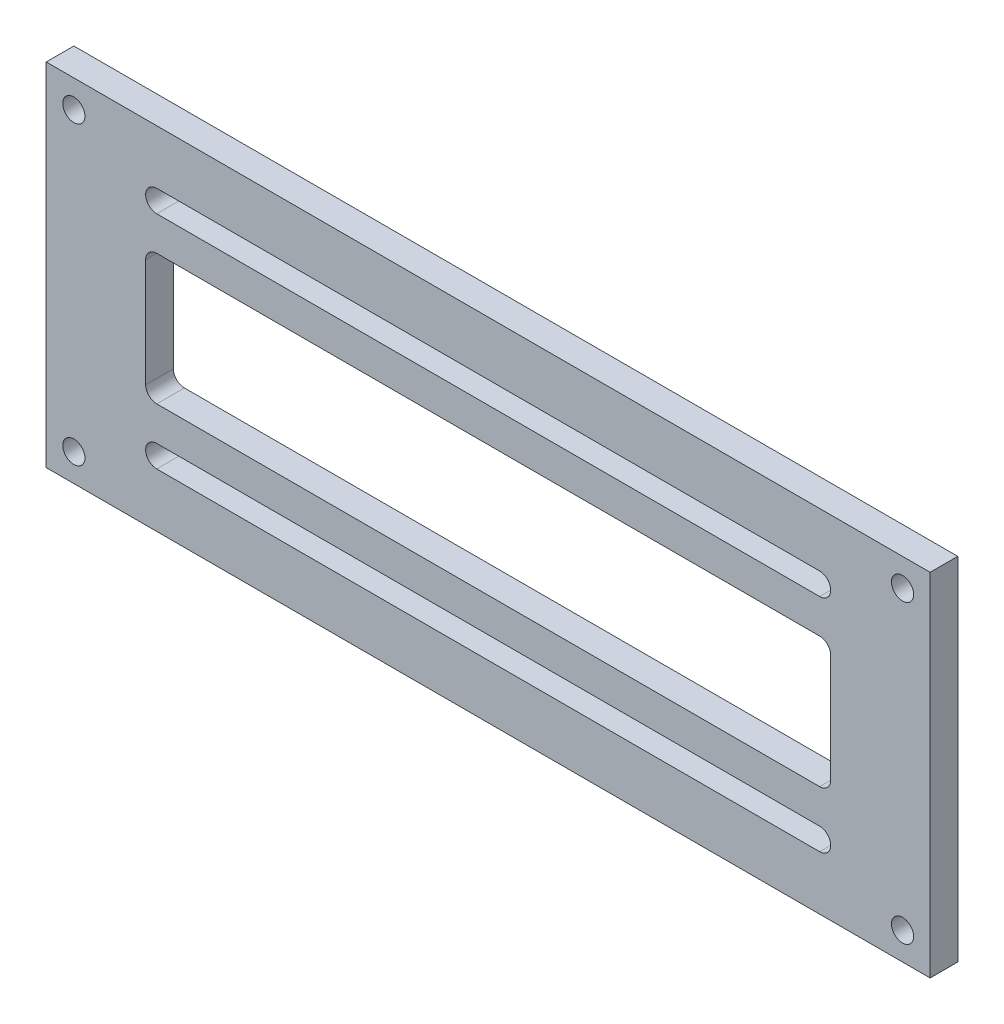
ISO-10303-21;
HEADER;
FILE_DESCRIPTION(('STEP AP214'),'2;1');
FILE_NAME('part.step','',(''),(''),'','','');
FILE_SCHEMA(('AUTOMOTIVE_DESIGN { 1 0 10303 214 1 1 1 1 }'));
ENDSEC;
DATA;
#1=APPLICATION_CONTEXT('core data for automotive mechanical design processes');
#2=APPLICATION_PROTOCOL_DEFINITION('international standard','automotive_design',2000,#1);
#3=PRODUCT_CONTEXT('',#1,'mechanical');
#4=PRODUCT('Part','Part','',(#3));
#5=PRODUCT_RELATED_PRODUCT_CATEGORY('part','',(#4));
#6=PRODUCT_DEFINITION_FORMATION('','',#4);
#7=PRODUCT_DEFINITION_CONTEXT('part definition',#1,'design');
#8=PRODUCT_DEFINITION('design','',#6,#7);
#9=PRODUCT_DEFINITION_SHAPE('','',#8);
#10=(LENGTH_UNIT() NAMED_UNIT(*) SI_UNIT(.MILLI.,.METRE.));
#11=(NAMED_UNIT(*) PLANE_ANGLE_UNIT() SI_UNIT($,.RADIAN.));
#12=(NAMED_UNIT(*) SI_UNIT($,.STERADIAN.) SOLID_ANGLE_UNIT());
#13=UNCERTAINTY_MEASURE_WITH_UNIT(LENGTH_MEASURE(1.E-05),#10,'distance_accuracy_value','');
#14=(GEOMETRIC_REPRESENTATION_CONTEXT(3) GLOBAL_UNCERTAINTY_ASSIGNED_CONTEXT((#13)) GLOBAL_UNIT_ASSIGNED_CONTEXT((#10,
#11,#12)) REPRESENTATION_CONTEXT('',''));
#15=CARTESIAN_POINT('',(0.,0.,0.));
#16=DIRECTION('',(0.,0.,1.));
#17=DIRECTION('',(1.,0.,0.));
#18=AXIS2_PLACEMENT_3D('',#15,#16,#17);
#19=CARTESIAN_POINT('',(101.6,40.386,0.));
#20=DIRECTION('',(0.,0.,1.));
#21=DIRECTION('',(1.,0.,0.));
#22=AXIS2_PLACEMENT_3D('',#19,#20,#21);
#23=PLANE('',#22);
#24=CARTESIAN_POINT('',(6.35,6.35,0.));
#25=DIRECTION('',(0.,0.,1.));
#26=DIRECTION('',(1.,0.,0.));
#27=AXIS2_PLACEMENT_3D('',#24,#25,#26);
#28=CIRCLE('',#27,2.5527);
#29=CARTESIAN_POINT('',(8.9027,6.35,0.));
#30=VERTEX_POINT('',#29);
#31=EDGE_CURVE('E248',#30,#30,#28,.T.);
#32=ORIENTED_EDGE('',*,*,#31,.T.);
#33=EDGE_LOOP('',(#32));
#34=FACE_BOUND('',#33,.T.);
#35=CARTESIAN_POINT('',(196.85,6.35,0.));
#36=DIRECTION('',(0.,0.,1.));
#37=DIRECTION('',(1.,0.,0.));
#38=AXIS2_PLACEMENT_3D('',#35,#36,#37);
#39=CIRCLE('',#38,2.5527);
#40=CARTESIAN_POINT('',(199.4027,6.35,0.));
#41=VERTEX_POINT('',#40);
#42=EDGE_CURVE('E252',#41,#41,#39,.T.);
#43=ORIENTED_EDGE('',*,*,#42,.T.);
#44=EDGE_LOOP('',(#43));
#45=FACE_BOUND('',#44,.T.);
#46=CARTESIAN_POINT('',(196.85,74.422,0.));
#47=DIRECTION('',(0.,0.,1.));
#48=DIRECTION('',(1.,0.,0.));
#49=AXIS2_PLACEMENT_3D('',#46,#47,#48);
#50=CIRCLE('',#49,2.5527);
#51=CARTESIAN_POINT('',(199.4027,74.422,0.));
#52=VERTEX_POINT('',#51);
#53=EDGE_CURVE('E255',#52,#52,#50,.T.);
#54=ORIENTED_EDGE('',*,*,#53,.T.);
#55=EDGE_LOOP('',(#54));
#56=FACE_BOUND('',#55,.T.);
#57=CARTESIAN_POINT('',(6.35,74.422,0.));
#58=DIRECTION('',(0.,0.,1.));
#59=DIRECTION('',(1.,0.,0.));
#60=AXIS2_PLACEMENT_3D('',#57,#58,#59);
#61=CIRCLE('',#60,2.5527);
#62=CARTESIAN_POINT('',(8.9027,74.422,0.));
#63=VERTEX_POINT('',#62);
#64=EDGE_CURVE('E258',#63,#63,#61,.T.);
#65=ORIENTED_EDGE('',*,*,#64,.T.);
#66=EDGE_LOOP('',(#65));
#67=FACE_BOUND('',#66,.T.);
#68=CARTESIAN_POINT('',(25.4,14.986,0.));
#69=DIRECTION('',(0.,0.,1.));
#70=DIRECTION('',(1.,0.,0.));
#71=AXIS2_PLACEMENT_3D('',#68,#69,#70);
#72=CIRCLE('',#71,2.54);
#73=CARTESIAN_POINT('',(25.4,17.526,0.));
#74=VERTEX_POINT('',#73);
#75=CARTESIAN_POINT('',(25.4,12.446,0.));
#76=VERTEX_POINT('',#75);
#77=EDGE_CURVE('E261',#74,#76,#72,.T.);
#78=ORIENTED_EDGE('',*,*,#77,.T.);
#79=DIRECTION('',(1.,0.,0.));
#80=VECTOR('',#79,1.);
#81=CARTESIAN_POINT('',(177.8,12.446,0.));
#82=LINE('',#81,#80);
#83=CARTESIAN_POINT('',(177.8,12.446,0.));
#84=VERTEX_POINT('',#83);
#85=EDGE_CURVE('E178',#76,#84,#82,.T.);
#86=ORIENTED_EDGE('',*,*,#85,.T.);
#87=CARTESIAN_POINT('',(177.8,14.986,0.));
#88=DIRECTION('',(0.,0.,1.));
#89=DIRECTION('',(1.,0.,0.));
#90=AXIS2_PLACEMENT_3D('',#87,#88,#89);
#91=CIRCLE('',#90,2.54);
#92=CARTESIAN_POINT('',(177.8,17.526,0.));
#93=VERTEX_POINT('',#92);
#94=EDGE_CURVE('E184',#84,#93,#91,.T.);
#95=ORIENTED_EDGE('',*,*,#94,.T.);
#96=DIRECTION('',(1.,0.,0.));
#97=VECTOR('',#96,1.);
#98=CARTESIAN_POINT('',(25.4,17.526,0.));
#99=LINE('',#98,#97);
#100=EDGE_CURVE('E182',#93,#74,#99,.F.);
#101=ORIENTED_EDGE('',*,*,#100,.T.);
#102=EDGE_LOOP('',(#78,#86,#95,#101));
#103=FACE_BOUND('',#102,.T.);
#104=CARTESIAN_POINT('',(177.8,65.786,0.));
#105=DIRECTION('',(0.,0.,1.));
#106=DIRECTION('',(1.,0.,0.));
#107=AXIS2_PLACEMENT_3D('',#104,#105,#106);
#108=CIRCLE('',#107,2.54);
#109=CARTESIAN_POINT('',(177.8,63.246,0.));
#110=VERTEX_POINT('',#109);
#111=CARTESIAN_POINT('',(177.8,68.326,0.));
#112=VERTEX_POINT('',#111);
#113=EDGE_CURVE('E265',#110,#112,#108,.T.);
#114=ORIENTED_EDGE('',*,*,#113,.T.);
#115=DIRECTION('',(1.,0.,0.));
#116=VECTOR('',#115,1.);
#117=CARTESIAN_POINT('',(25.4,68.326,0.));
#118=LINE('',#117,#116);
#119=CARTESIAN_POINT('',(25.4,68.326,0.));
#120=VERTEX_POINT('',#119);
#121=EDGE_CURVE('E186',#112,#120,#118,.F.);
#122=ORIENTED_EDGE('',*,*,#121,.T.);
#123=CARTESIAN_POINT('',(25.4,65.786,0.));
#124=DIRECTION('',(0.,0.,1.));
#125=DIRECTION('',(1.,0.,0.));
#126=AXIS2_PLACEMENT_3D('',#123,#124,#125);
#127=CIRCLE('',#126,2.54);
#128=CARTESIAN_POINT('',(25.4,63.246,0.));
#129=VERTEX_POINT('',#128);
#130=EDGE_CURVE('E192',#120,#129,#127,.T.);
#131=ORIENTED_EDGE('',*,*,#130,.T.);
#132=DIRECTION('',(1.,0.,0.));
#133=VECTOR('',#132,1.);
#134=CARTESIAN_POINT('',(177.8,63.246,0.));
#135=LINE('',#134,#133);
#136=EDGE_CURVE('E190',#129,#110,#135,.T.);
#137=ORIENTED_EDGE('',*,*,#136,.T.);
#138=EDGE_LOOP('',(#114,#122,#131,#137));
#139=FACE_BOUND('',#138,.T.);
#140=DIRECTION('',(1.,0.,0.));
#141=VECTOR('',#140,1.);
#142=CARTESIAN_POINT('',(25.4,55.372,0.));
#143=LINE('',#142,#141);
#144=CARTESIAN_POINT('',(177.8,55.372,0.));
#145=VERTEX_POINT('',#144);
#146=CARTESIAN_POINT('',(25.4,55.372,0.));
#147=VERTEX_POINT('',#146);
#148=EDGE_CURVE('E194',#145,#147,#143,.F.);
#149=ORIENTED_EDGE('',*,*,#148,.T.);
#150=CARTESIAN_POINT('',(25.4,52.832,0.));
#151=DIRECTION('',(0.,0.,1.));
#152=DIRECTION('',(1.,0.,0.));
#153=AXIS2_PLACEMENT_3D('',#150,#151,#152);
#154=CIRCLE('',#153,2.54);
#155=CARTESIAN_POINT('',(22.86,52.832,0.));
#156=VERTEX_POINT('',#155);
#157=EDGE_CURVE('E269',#147,#156,#154,.T.);
#158=ORIENTED_EDGE('',*,*,#157,.T.);
#159=DIRECTION('',(0.,1.,0.));
#160=VECTOR('',#159,1.);
#161=CARTESIAN_POINT('',(22.86,27.94,0.));
#162=LINE('',#161,#160);
#163=CARTESIAN_POINT('',(22.86,27.94,0.));
#164=VERTEX_POINT('',#163);
#165=EDGE_CURVE('E197',#156,#164,#162,.F.);
#166=ORIENTED_EDGE('',*,*,#165,.T.);
#167=CARTESIAN_POINT('',(25.4,27.94,0.));
#168=DIRECTION('',(0.,0.,1.));
#169=DIRECTION('',(1.,0.,0.));
#170=AXIS2_PLACEMENT_3D('',#167,#168,#169);
#171=CIRCLE('',#170,2.54);
#172=CARTESIAN_POINT('',(25.4,25.4,0.));
#173=VERTEX_POINT('',#172);
#174=EDGE_CURVE('E272',#164,#173,#171,.T.);
#175=ORIENTED_EDGE('',*,*,#174,.T.);
#176=DIRECTION('',(1.,0.,0.));
#177=VECTOR('',#176,1.);
#178=CARTESIAN_POINT('',(177.8,25.4,0.));
#179=LINE('',#178,#177);
#180=CARTESIAN_POINT('',(177.8,25.4,0.));
#181=VERTEX_POINT('',#180);
#182=EDGE_CURVE('E201',#173,#181,#179,.T.);
#183=ORIENTED_EDGE('',*,*,#182,.T.);
#184=CARTESIAN_POINT('',(177.8,27.94,0.));
#185=DIRECTION('',(0.,0.,1.));
#186=DIRECTION('',(1.,0.,0.));
#187=AXIS2_PLACEMENT_3D('',#184,#185,#186);
#188=CIRCLE('',#187,2.54);
#189=CARTESIAN_POINT('',(180.34,27.94,0.));
#190=VERTEX_POINT('',#189);
#191=EDGE_CURVE('E273',#181,#190,#188,.T.);
#192=ORIENTED_EDGE('',*,*,#191,.T.);
#193=DIRECTION('',(0.,1.,0.));
#194=VECTOR('',#193,1.);
#195=CARTESIAN_POINT('',(180.34,52.832,0.));
#196=LINE('',#195,#194);
#197=CARTESIAN_POINT('',(180.34,52.832,0.));
#198=VERTEX_POINT('',#197);
#199=EDGE_CURVE('E134',#190,#198,#196,.T.);
#200=ORIENTED_EDGE('',*,*,#199,.T.);
#201=CARTESIAN_POINT('',(177.8,52.832,0.));
#202=DIRECTION('',(0.,0.,1.));
#203=DIRECTION('',(1.,0.,0.));
#204=AXIS2_PLACEMENT_3D('',#201,#202,#203);
#205=CIRCLE('',#204,2.54);
#206=EDGE_CURVE('E20',#198,#145,#205,.T.);
#207=ORIENTED_EDGE('',*,*,#206,.T.);
#208=EDGE_LOOP('',(#149,#158,#166,#175,#183,#192,#200,#207));
#209=FACE_BOUND('',#208,.T.);
#210=DIRECTION('',(0.,1.,0.));
#211=VECTOR('',#210,1.);
#212=CARTESIAN_POINT('',(0.,0.,0.));
#213=LINE('',#212,#211);
#214=CARTESIAN_POINT('',(0.,80.772,0.));
#215=VERTEX_POINT('',#214);
#216=CARTESIAN_POINT('',(0.,0.,0.));
#217=VERTEX_POINT('',#216);
#218=EDGE_CURVE('E143',#215,#217,#213,.F.);
#219=ORIENTED_EDGE('',*,*,#218,.F.);
#220=DIRECTION('',(1.,0.,0.));
#221=VECTOR('',#220,1.);
#222=CARTESIAN_POINT('',(0.,80.772,0.));
#223=LINE('',#222,#221);
#224=CARTESIAN_POINT('',(203.2,80.772,0.));
#225=VERTEX_POINT('',#224);
#226=EDGE_CURVE('E283',#225,#215,#223,.F.);
#227=ORIENTED_EDGE('',*,*,#226,.F.);
#228=DIRECTION('',(0.,1.,0.));
#229=VECTOR('',#228,1.);
#230=CARTESIAN_POINT('',(203.2,80.772,0.));
#231=LINE('',#230,#229);
#232=CARTESIAN_POINT('',(203.2,0.,0.));
#233=VERTEX_POINT('',#232);
#234=EDGE_CURVE('E167',#233,#225,#231,.T.);
#235=ORIENTED_EDGE('',*,*,#234,.F.);
#236=DIRECTION('',(1.,0.,0.));
#237=VECTOR('',#236,1.);
#238=CARTESIAN_POINT('',(203.2,0.,0.));
#239=LINE('',#238,#237);
#240=EDGE_CURVE('E155',#217,#233,#239,.T.);
#241=ORIENTED_EDGE('',*,*,#240,.F.);
#242=EDGE_LOOP('',(#219,#227,#235,#241));
#243=FACE_BOUND('',#242,.T.);
#244=ADVANCED_FACE('F17',(#34,#45,#56,#67,#103,#139,#209,#243),#23,.F.);
#245=CARTESIAN_POINT('',(0.,0.,0.));
#246=DIRECTION('',(-1.,0.,0.));
#247=DIRECTION('',(0.,0.,1.));
#248=AXIS2_PLACEMENT_3D('',#245,#246,#247);
#249=PLANE('',#248);
#250=ORIENTED_EDGE('',*,*,#218,.T.);
#251=DIRECTION('',(0.,0.,-1.));
#252=VECTOR('',#251,1.);
#253=CARTESIAN_POINT('',(0.,0.,0.));
#254=LINE('',#253,#252);
#255=CARTESIAN_POINT('',(0.,0.,6.35));
#256=VERTEX_POINT('',#255);
#257=EDGE_CURVE('E161',#256,#217,#254,.T.);
#258=ORIENTED_EDGE('',*,*,#257,.F.);
#259=DIRECTION('',(0.,1.,0.));
#260=VECTOR('',#259,1.);
#261=CARTESIAN_POINT('',(0.,40.386,6.35));
#262=LINE('',#261,#260);
#263=CARTESIAN_POINT('',(0.,80.772,6.35));
#264=VERTEX_POINT('',#263);
#265=EDGE_CURVE('E251',#264,#256,#262,.F.);
#266=ORIENTED_EDGE('',*,*,#265,.F.);
#267=DIRECTION('',(0.,0.,1.));
#268=VECTOR('',#267,1.);
#269=CARTESIAN_POINT('',(0.,80.772,0.));
#270=LINE('',#269,#268);
#271=EDGE_CURVE('E164',#215,#264,#270,.T.);
#272=ORIENTED_EDGE('',*,*,#271,.F.);
#273=EDGE_LOOP('',(#250,#258,#266,#272));
#274=FACE_BOUND('',#273,.T.);
#275=ADVANCED_FACE('F159',(#274),#249,.T.);
#276=CARTESIAN_POINT('',(203.2,0.,0.));
#277=DIRECTION('',(0.,-1.,0.));
#278=DIRECTION('',(0.,0.,-1.));
#279=AXIS2_PLACEMENT_3D('',#276,#277,#278);
#280=PLANE('',#279);
#281=ORIENTED_EDGE('',*,*,#240,.T.);
#282=DIRECTION('',(0.,0.,-1.));
#283=VECTOR('',#282,1.);
#284=CARTESIAN_POINT('',(203.2,0.,0.));
#285=LINE('',#284,#283);
#286=CARTESIAN_POINT('',(203.2,0.,6.35));
#287=VERTEX_POINT('',#286);
#288=EDGE_CURVE('E169',#287,#233,#285,.T.);
#289=ORIENTED_EDGE('',*,*,#288,.F.);
#290=DIRECTION('',(1.,0.,0.));
#291=VECTOR('',#290,1.);
#292=CARTESIAN_POINT('',(101.6,0.,6.35));
#293=LINE('',#292,#291);
#294=EDGE_CURVE('E173',#256,#287,#293,.T.);
#295=ORIENTED_EDGE('',*,*,#294,.F.);
#296=ORIENTED_EDGE('',*,*,#257,.T.);
#297=EDGE_LOOP('',(#281,#289,#295,#296));
#298=FACE_BOUND('',#297,.T.);
#299=ADVANCED_FACE('F171',(#298),#280,.T.);
#300=CARTESIAN_POINT('',(203.2,80.772,0.));
#301=DIRECTION('',(1.,0.,0.));
#302=DIRECTION('',(0.,0.,-1.));
#303=AXIS2_PLACEMENT_3D('',#300,#301,#302);
#304=PLANE('',#303);
#305=ORIENTED_EDGE('',*,*,#234,.T.);
#306=DIRECTION('',(0.,0.,1.));
#307=VECTOR('',#306,1.);
#308=CARTESIAN_POINT('',(203.2,80.772,0.));
#309=LINE('',#308,#307);
#310=CARTESIAN_POINT('',(203.2,80.772,6.35));
#311=VERTEX_POINT('',#310);
#312=EDGE_CURVE('E285',#311,#225,#309,.F.);
#313=ORIENTED_EDGE('',*,*,#312,.F.);
#314=DIRECTION('',(0.,1.,0.));
#315=VECTOR('',#314,1.);
#316=CARTESIAN_POINT('',(203.2,40.386,6.35));
#317=LINE('',#316,#315);
#318=EDGE_CURVE('E294',#287,#311,#317,.T.);
#319=ORIENTED_EDGE('',*,*,#318,.F.);
#320=ORIENTED_EDGE('',*,*,#288,.T.);
#321=EDGE_LOOP('',(#305,#313,#319,#320));
#322=FACE_BOUND('',#321,.T.);
#323=ADVANCED_FACE('F290',(#322),#304,.T.);
#324=CARTESIAN_POINT('',(0.,80.772,0.));
#325=DIRECTION('',(0.,1.,0.));
#326=DIRECTION('',(0.,0.,1.));
#327=AXIS2_PLACEMENT_3D('',#324,#325,#326);
#328=PLANE('',#327);
#329=ORIENTED_EDGE('',*,*,#226,.T.);
#330=ORIENTED_EDGE('',*,*,#271,.T.);
#331=DIRECTION('',(1.,0.,0.));
#332=VECTOR('',#331,1.);
#333=CARTESIAN_POINT('',(101.6,80.772,6.35));
#334=LINE('',#333,#332);
#335=EDGE_CURVE('E247',#311,#264,#334,.F.);
#336=ORIENTED_EDGE('',*,*,#335,.F.);
#337=ORIENTED_EDGE('',*,*,#312,.T.);
#338=EDGE_LOOP('',(#329,#330,#336,#337));
#339=FACE_BOUND('',#338,.T.);
#340=ADVANCED_FACE('F302',(#339),#328,.T.);
#341=CARTESIAN_POINT('',(177.8,52.832,0.));
#342=DIRECTION('',(0.,0.,1.));
#343=DIRECTION('',(1.,0.,0.));
#344=AXIS2_PLACEMENT_3D('',#341,#342,#343);
#345=CYLINDRICAL_SURFACE('',#344,2.54);
#346=DIRECTION('',(0.,0.,1.));
#347=VECTOR('',#346,1.);
#348=CARTESIAN_POINT('',(177.8,55.372,0.));
#349=LINE('',#348,#347);
#350=CARTESIAN_POINT('',(177.8,55.372,6.35));
#351=VERTEX_POINT('',#350);
#352=EDGE_CURVE('E196',#351,#145,#349,.F.);
#353=ORIENTED_EDGE('',*,*,#352,.T.);
#354=ORIENTED_EDGE('',*,*,#206,.F.);
#355=DIRECTION('',(0.,0.,-1.));
#356=VECTOR('',#355,1.);
#357=CARTESIAN_POINT('',(180.34,52.832,0.));
#358=LINE('',#357,#356);
#359=CARTESIAN_POINT('',(180.34,52.832,6.35));
#360=VERTEX_POINT('',#359);
#361=EDGE_CURVE('E205',#198,#360,#358,.F.);
#362=ORIENTED_EDGE('',*,*,#361,.T.);
#363=CARTESIAN_POINT('',(177.8,52.832,6.35));
#364=DIRECTION('',(0.,0.,1.));
#365=DIRECTION('',(1.,0.,0.));
#366=AXIS2_PLACEMENT_3D('',#363,#364,#365);
#367=CIRCLE('',#366,2.54);
#368=EDGE_CURVE('E244',#351,#360,#367,.F.);
#369=ORIENTED_EDGE('',*,*,#368,.F.);
#370=EDGE_LOOP('',(#353,#354,#362,#369));
#371=FACE_BOUND('',#370,.T.);
#372=ADVANCED_FACE('F343',(#371),#345,.F.);
#373=CARTESIAN_POINT('',(180.34,52.832,0.));
#374=DIRECTION('',(1.,0.,0.));
#375=DIRECTION('',(0.,0.,-1.));
#376=AXIS2_PLACEMENT_3D('',#373,#374,#375);
#377=PLANE('',#376);
#378=ORIENTED_EDGE('',*,*,#361,.F.);
#379=ORIENTED_EDGE('',*,*,#199,.F.);
#380=DIRECTION('',(0.,0.,1.));
#381=VECTOR('',#380,1.);
#382=CARTESIAN_POINT('',(180.34,27.94,0.));
#383=LINE('',#382,#381);
#384=CARTESIAN_POINT('',(180.34,27.94,6.35));
#385=VERTEX_POINT('',#384);
#386=EDGE_CURVE('E204',#190,#385,#383,.T.);
#387=ORIENTED_EDGE('',*,*,#386,.T.);
#388=DIRECTION('',(0.,1.,0.));
#389=VECTOR('',#388,1.);
#390=CARTESIAN_POINT('',(180.34,40.386,6.35));
#391=LINE('',#390,#389);
#392=EDGE_CURVE('E243',#360,#385,#391,.F.);
#393=ORIENTED_EDGE('',*,*,#392,.F.);
#394=EDGE_LOOP('',(#378,#379,#387,#393));
#395=FACE_BOUND('',#394,.T.);
#396=ADVANCED_FACE('F341',(#395),#377,.F.);
#397=CARTESIAN_POINT('',(177.8,27.94,0.));
#398=DIRECTION('',(0.,0.,1.));
#399=DIRECTION('',(1.,0.,0.));
#400=AXIS2_PLACEMENT_3D('',#397,#398,#399);
#401=CYLINDRICAL_SURFACE('',#400,2.54);
#402=ORIENTED_EDGE('',*,*,#386,.F.);
#403=ORIENTED_EDGE('',*,*,#191,.F.);
#404=DIRECTION('',(0.,0.,-1.));
#405=VECTOR('',#404,1.);
#406=CARTESIAN_POINT('',(177.8,25.4,0.));
#407=LINE('',#406,#405);
#408=CARTESIAN_POINT('',(177.8,25.4,6.35));
#409=VERTEX_POINT('',#408);
#410=EDGE_CURVE('E203',#181,#409,#407,.F.);
#411=ORIENTED_EDGE('',*,*,#410,.T.);
#412=CARTESIAN_POINT('',(177.8,27.94,6.35));
#413=DIRECTION('',(0.,0.,1.));
#414=DIRECTION('',(1.,0.,0.));
#415=AXIS2_PLACEMENT_3D('',#412,#413,#414);
#416=CIRCLE('',#415,2.54);
#417=EDGE_CURVE('E240',#385,#409,#416,.F.);
#418=ORIENTED_EDGE('',*,*,#417,.F.);
#419=EDGE_LOOP('',(#402,#403,#411,#418));
#420=FACE_BOUND('',#419,.T.);
#421=ADVANCED_FACE('F330',(#420),#401,.F.);
#422=CARTESIAN_POINT('',(177.8,25.4,0.));
#423=DIRECTION('',(0.,-1.,0.));
#424=DIRECTION('',(0.,0.,-1.));
#425=AXIS2_PLACEMENT_3D('',#422,#423,#424);
#426=PLANE('',#425);
#427=ORIENTED_EDGE('',*,*,#410,.F.);
#428=ORIENTED_EDGE('',*,*,#182,.F.);
#429=DIRECTION('',(0.,0.,1.));
#430=VECTOR('',#429,1.);
#431=CARTESIAN_POINT('',(25.4,25.4,0.));
#432=LINE('',#431,#430);
#433=CARTESIAN_POINT('',(25.4,25.4,6.35));
#434=VERTEX_POINT('',#433);
#435=EDGE_CURVE('E200',#173,#434,#432,.T.);
#436=ORIENTED_EDGE('',*,*,#435,.T.);
#437=DIRECTION('',(1.,0.,0.));
#438=VECTOR('',#437,1.);
#439=CARTESIAN_POINT('',(101.6,25.4,6.35));
#440=LINE('',#439,#438);
#441=EDGE_CURVE('E239',#409,#434,#440,.F.);
#442=ORIENTED_EDGE('',*,*,#441,.F.);
#443=EDGE_LOOP('',(#427,#428,#436,#442));
#444=FACE_BOUND('',#443,.T.);
#445=ADVANCED_FACE('F335',(#444),#426,.F.);
#446=CARTESIAN_POINT('',(25.4,27.94,0.));
#447=DIRECTION('',(0.,0.,1.));
#448=DIRECTION('',(1.,0.,0.));
#449=AXIS2_PLACEMENT_3D('',#446,#447,#448);
#450=CYLINDRICAL_SURFACE('',#449,2.54);
#451=ORIENTED_EDGE('',*,*,#435,.F.);
#452=ORIENTED_EDGE('',*,*,#174,.F.);
#453=DIRECTION('',(0.,0.,1.));
#454=VECTOR('',#453,1.);
#455=CARTESIAN_POINT('',(22.86,27.94,0.));
#456=LINE('',#455,#454);
#457=CARTESIAN_POINT('',(22.86,27.94,6.35));
#458=VERTEX_POINT('',#457);
#459=EDGE_CURVE('E199',#164,#458,#456,.T.);
#460=ORIENTED_EDGE('',*,*,#459,.T.);
#461=CARTESIAN_POINT('',(25.4,27.94,6.35));
#462=DIRECTION('',(0.,0.,1.));
#463=DIRECTION('',(1.,0.,0.));
#464=AXIS2_PLACEMENT_3D('',#461,#462,#463);
#465=CIRCLE('',#464,2.54);
#466=EDGE_CURVE('E236',#434,#458,#465,.F.);
#467=ORIENTED_EDGE('',*,*,#466,.F.);
#468=EDGE_LOOP('',(#451,#452,#460,#467));
#469=FACE_BOUND('',#468,.T.);
#470=ADVANCED_FACE('F417',(#469),#450,.F.);
#471=CARTESIAN_POINT('',(22.86,27.94,0.));
#472=DIRECTION('',(-1.,0.,0.));
#473=DIRECTION('',(0.,0.,1.));
#474=AXIS2_PLACEMENT_3D('',#471,#472,#473);
#475=PLANE('',#474);
#476=ORIENTED_EDGE('',*,*,#459,.F.);
#477=ORIENTED_EDGE('',*,*,#165,.F.);
#478=DIRECTION('',(0.,0.,1.));
#479=VECTOR('',#478,1.);
#480=CARTESIAN_POINT('',(22.86,52.832,0.));
#481=LINE('',#480,#479);
#482=CARTESIAN_POINT('',(22.86,52.832,6.35));
#483=VERTEX_POINT('',#482);
#484=EDGE_CURVE('E271',#156,#483,#481,.T.);
#485=ORIENTED_EDGE('',*,*,#484,.T.);
#486=DIRECTION('',(0.,1.,0.));
#487=VECTOR('',#486,1.);
#488=CARTESIAN_POINT('',(22.86,40.386,6.35));
#489=LINE('',#488,#487);
#490=EDGE_CURVE('E235',#458,#483,#489,.T.);
#491=ORIENTED_EDGE('',*,*,#490,.F.);
#492=EDGE_LOOP('',(#476,#477,#485,#491));
#493=FACE_BOUND('',#492,.T.);
#494=ADVANCED_FACE('F413',(#493),#475,.F.);
#495=CARTESIAN_POINT('',(25.4,52.832,0.));
#496=DIRECTION('',(0.,0.,1.));
#497=DIRECTION('',(1.,0.,0.));
#498=AXIS2_PLACEMENT_3D('',#495,#496,#497);
#499=CYLINDRICAL_SURFACE('',#498,2.54);
#500=ORIENTED_EDGE('',*,*,#484,.F.);
#501=ORIENTED_EDGE('',*,*,#157,.F.);
#502=DIRECTION('',(0.,0.,1.));
#503=VECTOR('',#502,1.);
#504=CARTESIAN_POINT('',(25.4,55.372,0.));
#505=LINE('',#504,#503);
#506=CARTESIAN_POINT('',(25.4,55.372,6.35));
#507=VERTEX_POINT('',#506);
#508=EDGE_CURVE('E193',#147,#507,#505,.T.);
#509=ORIENTED_EDGE('',*,*,#508,.T.);
#510=CARTESIAN_POINT('',(25.4,52.832,6.35));
#511=DIRECTION('',(0.,0.,1.));
#512=DIRECTION('',(1.,0.,0.));
#513=AXIS2_PLACEMENT_3D('',#510,#511,#512);
#514=CIRCLE('',#513,2.54);
#515=EDGE_CURVE('E231',#483,#507,#514,.F.);
#516=ORIENTED_EDGE('',*,*,#515,.F.);
#517=EDGE_LOOP('',(#500,#501,#509,#516));
#518=FACE_BOUND('',#517,.T.);
#519=ADVANCED_FACE('F409',(#518),#499,.F.);
#520=CARTESIAN_POINT('',(25.4,55.372,0.));
#521=DIRECTION('',(0.,1.,0.));
#522=DIRECTION('',(0.,0.,1.));
#523=AXIS2_PLACEMENT_3D('',#520,#521,#522);
#524=PLANE('',#523);
#525=ORIENTED_EDGE('',*,*,#508,.F.);
#526=ORIENTED_EDGE('',*,*,#148,.F.);
#527=ORIENTED_EDGE('',*,*,#352,.F.);
#528=DIRECTION('',(1.,0.,0.));
#529=VECTOR('',#528,1.);
#530=CARTESIAN_POINT('',(101.6,55.372,6.35));
#531=LINE('',#530,#529);
#532=EDGE_CURVE('E234',#507,#351,#531,.T.);
#533=ORIENTED_EDGE('',*,*,#532,.F.);
#534=EDGE_LOOP('',(#525,#526,#527,#533));
#535=FACE_BOUND('',#534,.T.);
#536=ADVANCED_FACE('F405',(#535),#524,.F.);
#537=CARTESIAN_POINT('',(177.8,63.246,0.));
#538=DIRECTION('',(0.,-1.,0.));
#539=DIRECTION('',(0.,0.,-1.));
#540=AXIS2_PLACEMENT_3D('',#537,#538,#539);
#541=PLANE('',#540);
#542=DIRECTION('',(0.,0.,1.));
#543=VECTOR('',#542,1.);
#544=CARTESIAN_POINT('',(177.8,63.246,0.));
#545=LINE('',#544,#543);
#546=CARTESIAN_POINT('',(177.8,63.246,6.35));
#547=VERTEX_POINT('',#546);
#548=EDGE_CURVE('E267',#547,#110,#545,.F.);
#549=ORIENTED_EDGE('',*,*,#548,.T.);
#550=ORIENTED_EDGE('',*,*,#136,.F.);
#551=DIRECTION('',(0.,0.,1.));
#552=VECTOR('',#551,1.);
#553=CARTESIAN_POINT('',(25.4,63.246,0.));
#554=LINE('',#553,#552);
#555=CARTESIAN_POINT('',(25.4,63.246,6.35));
#556=VERTEX_POINT('',#555);
#557=EDGE_CURVE('E189',#129,#556,#554,.T.);
#558=ORIENTED_EDGE('',*,*,#557,.T.);
#559=DIRECTION('',(1.,0.,0.));
#560=VECTOR('',#559,1.);
#561=CARTESIAN_POINT('',(101.6,63.246,6.35));
#562=LINE('',#561,#560);
#563=EDGE_CURVE('E230',#547,#556,#562,.F.);
#564=ORIENTED_EDGE('',*,*,#563,.F.);
#565=EDGE_LOOP('',(#549,#550,#558,#564));
#566=FACE_BOUND('',#565,.T.);
#567=ADVANCED_FACE('F401',(#566),#541,.F.);
#568=CARTESIAN_POINT('',(25.4,65.786,0.));
#569=DIRECTION('',(0.,0.,1.));
#570=DIRECTION('',(1.,0.,0.));
#571=AXIS2_PLACEMENT_3D('',#568,#569,#570);
#572=CYLINDRICAL_SURFACE('',#571,2.54);
#573=ORIENTED_EDGE('',*,*,#557,.F.);
#574=ORIENTED_EDGE('',*,*,#130,.F.);
#575=DIRECTION('',(0.,0.,1.));
#576=VECTOR('',#575,1.);
#577=CARTESIAN_POINT('',(25.4,68.326,0.));
#578=LINE('',#577,#576);
#579=CARTESIAN_POINT('',(25.4,68.326,6.35));
#580=VERTEX_POINT('',#579);
#581=EDGE_CURVE('E188',#120,#580,#578,.T.);
#582=ORIENTED_EDGE('',*,*,#581,.T.);
#583=CARTESIAN_POINT('',(25.4,65.786,6.35));
#584=DIRECTION('',(0.,0.,1.));
#585=DIRECTION('',(1.,0.,0.));
#586=AXIS2_PLACEMENT_3D('',#583,#584,#585);
#587=CIRCLE('',#586,2.54);
#588=EDGE_CURVE('E227',#556,#580,#587,.F.);
#589=ORIENTED_EDGE('',*,*,#588,.F.);
#590=EDGE_LOOP('',(#573,#574,#582,#589));
#591=FACE_BOUND('',#590,.T.);
#592=ADVANCED_FACE('F397',(#591),#572,.F.);
#593=CARTESIAN_POINT('',(25.4,68.326,0.));
#594=DIRECTION('',(0.,1.,0.));
#595=DIRECTION('',(0.,0.,1.));
#596=AXIS2_PLACEMENT_3D('',#593,#594,#595);
#597=PLANE('',#596);
#598=ORIENTED_EDGE('',*,*,#581,.F.);
#599=ORIENTED_EDGE('',*,*,#121,.F.);
#600=DIRECTION('',(0.,0.,1.));
#601=VECTOR('',#600,1.);
#602=CARTESIAN_POINT('',(177.8,68.326,0.));
#603=LINE('',#602,#601);
#604=CARTESIAN_POINT('',(177.8,68.326,6.35));
#605=VERTEX_POINT('',#604);
#606=EDGE_CURVE('E185',#112,#605,#603,.T.);
#607=ORIENTED_EDGE('',*,*,#606,.T.);
#608=DIRECTION('',(1.,0.,0.));
#609=VECTOR('',#608,1.);
#610=CARTESIAN_POINT('',(101.6,68.326,6.35));
#611=LINE('',#610,#609);
#612=EDGE_CURVE('E226',#580,#605,#611,.T.);
#613=ORIENTED_EDGE('',*,*,#612,.F.);
#614=EDGE_LOOP('',(#598,#599,#607,#613));
#615=FACE_BOUND('',#614,.T.);
#616=ADVANCED_FACE('F393',(#615),#597,.F.);
#617=CARTESIAN_POINT('',(177.8,65.786,0.));
#618=DIRECTION('',(0.,0.,1.));
#619=DIRECTION('',(1.,0.,0.));
#620=AXIS2_PLACEMENT_3D('',#617,#618,#619);
#621=CYLINDRICAL_SURFACE('',#620,2.54);
#622=ORIENTED_EDGE('',*,*,#606,.F.);
#623=ORIENTED_EDGE('',*,*,#113,.F.);
#624=ORIENTED_EDGE('',*,*,#548,.F.);
#625=CARTESIAN_POINT('',(177.8,65.786,6.35));
#626=DIRECTION('',(0.,0.,1.));
#627=DIRECTION('',(1.,0.,0.));
#628=AXIS2_PLACEMENT_3D('',#625,#626,#627);
#629=CIRCLE('',#628,2.54);
#630=EDGE_CURVE('E223',#605,#547,#629,.F.);
#631=ORIENTED_EDGE('',*,*,#630,.F.);
#632=EDGE_LOOP('',(#622,#623,#624,#631));
#633=FACE_BOUND('',#632,.T.);
#634=ADVANCED_FACE('F389',(#633),#621,.F.);
#635=CARTESIAN_POINT('',(25.4,17.526,0.));
#636=DIRECTION('',(0.,1.,0.));
#637=DIRECTION('',(0.,0.,1.));
#638=AXIS2_PLACEMENT_3D('',#635,#636,#637);
#639=PLANE('',#638);
#640=DIRECTION('',(0.,0.,1.));
#641=VECTOR('',#640,1.);
#642=CARTESIAN_POINT('',(25.4,17.526,0.));
#643=LINE('',#642,#641);
#644=CARTESIAN_POINT('',(25.4,17.526,6.35));
#645=VERTEX_POINT('',#644);
#646=EDGE_CURVE('E263',#645,#74,#643,.F.);
#647=ORIENTED_EDGE('',*,*,#646,.T.);
#648=ORIENTED_EDGE('',*,*,#100,.F.);
#649=DIRECTION('',(0.,0.,1.));
#650=VECTOR('',#649,1.);
#651=CARTESIAN_POINT('',(177.8,17.526,0.));
#652=LINE('',#651,#650);
#653=CARTESIAN_POINT('',(177.8,17.526,6.35));
#654=VERTEX_POINT('',#653);
#655=EDGE_CURVE('E181',#93,#654,#652,.T.);
#656=ORIENTED_EDGE('',*,*,#655,.T.);
#657=DIRECTION('',(1.,0.,0.));
#658=VECTOR('',#657,1.);
#659=CARTESIAN_POINT('',(101.6,17.526,6.35));
#660=LINE('',#659,#658);
#661=EDGE_CURVE('E222',#645,#654,#660,.T.);
#662=ORIENTED_EDGE('',*,*,#661,.F.);
#663=EDGE_LOOP('',(#647,#648,#656,#662));
#664=FACE_BOUND('',#663,.T.);
#665=ADVANCED_FACE('F385',(#664),#639,.F.);
#666=CARTESIAN_POINT('',(177.8,14.986,0.));
#667=DIRECTION('',(0.,0.,1.));
#668=DIRECTION('',(1.,0.,0.));
#669=AXIS2_PLACEMENT_3D('',#666,#667,#668);
#670=CYLINDRICAL_SURFACE('',#669,2.54);
#671=ORIENTED_EDGE('',*,*,#655,.F.);
#672=ORIENTED_EDGE('',*,*,#94,.F.);
#673=DIRECTION('',(0.,0.,-1.));
#674=VECTOR('',#673,1.);
#675=CARTESIAN_POINT('',(177.8,12.446,0.));
#676=LINE('',#675,#674);
#677=CARTESIAN_POINT('',(177.8,12.446,6.35));
#678=VERTEX_POINT('',#677);
#679=EDGE_CURVE('E180',#84,#678,#676,.F.);
#680=ORIENTED_EDGE('',*,*,#679,.T.);
#681=CARTESIAN_POINT('',(177.8,14.986,6.35));
#682=DIRECTION('',(0.,0.,1.));
#683=DIRECTION('',(1.,0.,0.));
#684=AXIS2_PLACEMENT_3D('',#681,#682,#683);
#685=CIRCLE('',#684,2.54);
#686=EDGE_CURVE('E219',#654,#678,#685,.F.);
#687=ORIENTED_EDGE('',*,*,#686,.F.);
#688=EDGE_LOOP('',(#671,#672,#680,#687));
#689=FACE_BOUND('',#688,.T.);
#690=ADVANCED_FACE('F382',(#689),#670,.F.);
#691=CARTESIAN_POINT('',(177.8,12.446,0.));
#692=DIRECTION('',(0.,-1.,0.));
#693=DIRECTION('',(0.,0.,-1.));
#694=AXIS2_PLACEMENT_3D('',#691,#692,#693);
#695=PLANE('',#694);
#696=ORIENTED_EDGE('',*,*,#679,.F.);
#697=ORIENTED_EDGE('',*,*,#85,.F.);
#698=DIRECTION('',(0.,0.,1.));
#699=VECTOR('',#698,1.);
#700=CARTESIAN_POINT('',(25.4,12.446,0.));
#701=LINE('',#700,#699);
#702=CARTESIAN_POINT('',(25.4,12.446,6.35));
#703=VERTEX_POINT('',#702);
#704=EDGE_CURVE('E35',#76,#703,#701,.T.);
#705=ORIENTED_EDGE('',*,*,#704,.T.);
#706=DIRECTION('',(1.,0.,0.));
#707=VECTOR('',#706,1.);
#708=CARTESIAN_POINT('',(101.6,12.446,6.35));
#709=LINE('',#708,#707);
#710=EDGE_CURVE('E218',#678,#703,#709,.F.);
#711=ORIENTED_EDGE('',*,*,#710,.F.);
#712=EDGE_LOOP('',(#696,#697,#705,#711));
#713=FACE_BOUND('',#712,.T.);
#714=ADVANCED_FACE('F378',(#713),#695,.F.);
#715=CARTESIAN_POINT('',(25.4,14.986,0.));
#716=DIRECTION('',(0.,0.,1.));
#717=DIRECTION('',(1.,0.,0.));
#718=AXIS2_PLACEMENT_3D('',#715,#716,#717);
#719=CYLINDRICAL_SURFACE('',#718,2.54);
#720=ORIENTED_EDGE('',*,*,#704,.F.);
#721=ORIENTED_EDGE('',*,*,#77,.F.);
#722=ORIENTED_EDGE('',*,*,#646,.F.);
#723=CARTESIAN_POINT('',(25.4,14.986,6.35));
#724=DIRECTION('',(0.,0.,1.));
#725=DIRECTION('',(1.,0.,0.));
#726=AXIS2_PLACEMENT_3D('',#723,#724,#725);
#727=CIRCLE('',#726,2.54);
#728=EDGE_CURVE('E215',#703,#645,#727,.F.);
#729=ORIENTED_EDGE('',*,*,#728,.F.);
#730=EDGE_LOOP('',(#720,#721,#722,#729));
#731=FACE_BOUND('',#730,.T.);
#732=ADVANCED_FACE('F374',(#731),#719,.F.);
#733=CARTESIAN_POINT('',(6.35,74.422,0.));
#734=DIRECTION('',(0.,0.,1.));
#735=DIRECTION('',(1.,0.,0.));
#736=AXIS2_PLACEMENT_3D('',#733,#734,#735);
#737=CYLINDRICAL_SURFACE('',#736,2.5527);
#738=ORIENTED_EDGE('',*,*,#64,.F.);
#739=EDGE_LOOP('',(#738));
#740=FACE_BOUND('',#739,.T.);
#741=CARTESIAN_POINT('',(6.35,74.422,6.35));
#742=DIRECTION('',(0.,0.,1.));
#743=DIRECTION('',(1.,0.,0.));
#744=AXIS2_PLACEMENT_3D('',#741,#742,#743);
#745=CIRCLE('',#744,2.5527);
#746=CARTESIAN_POINT('',(8.9027,74.422,6.35));
#747=VERTEX_POINT('',#746);
#748=EDGE_CURVE('E212',#747,#747,#745,.F.);
#749=ORIENTED_EDGE('',*,*,#748,.F.);
#750=EDGE_LOOP('',(#749));
#751=FACE_BOUND('',#750,.T.);
#752=ADVANCED_FACE('F370',(#740,#751),#737,.F.);
#753=CARTESIAN_POINT('',(196.85,74.422,0.));
#754=DIRECTION('',(0.,0.,1.));
#755=DIRECTION('',(1.,0.,0.));
#756=AXIS2_PLACEMENT_3D('',#753,#754,#755);
#757=CYLINDRICAL_SURFACE('',#756,2.5527);
#758=ORIENTED_EDGE('',*,*,#53,.F.);
#759=EDGE_LOOP('',(#758));
#760=FACE_BOUND('',#759,.T.);
#761=CARTESIAN_POINT('',(196.85,74.422,6.35));
#762=DIRECTION('',(0.,0.,1.));
#763=DIRECTION('',(1.,0.,0.));
#764=AXIS2_PLACEMENT_3D('',#761,#762,#763);
#765=CIRCLE('',#764,2.5527);
#766=CARTESIAN_POINT('',(199.4027,74.422,6.35));
#767=VERTEX_POINT('',#766);
#768=EDGE_CURVE('E209',#767,#767,#765,.F.);
#769=ORIENTED_EDGE('',*,*,#768,.F.);
#770=EDGE_LOOP('',(#769));
#771=FACE_BOUND('',#770,.T.);
#772=ADVANCED_FACE('F366',(#760,#771),#757,.F.);
#773=CARTESIAN_POINT('',(196.85,6.35,0.));
#774=DIRECTION('',(0.,0.,1.));
#775=DIRECTION('',(1.,0.,0.));
#776=AXIS2_PLACEMENT_3D('',#773,#774,#775);
#777=CYLINDRICAL_SURFACE('',#776,2.5527);
#778=ORIENTED_EDGE('',*,*,#42,.F.);
#779=EDGE_LOOP('',(#778));
#780=FACE_BOUND('',#779,.T.);
#781=CARTESIAN_POINT('',(196.85,6.35,6.35));
#782=DIRECTION('',(0.,0.,1.));
#783=DIRECTION('',(1.,0.,0.));
#784=AXIS2_PLACEMENT_3D('',#781,#782,#783);
#785=CIRCLE('',#784,2.5527);
#786=CARTESIAN_POINT('',(199.4027,6.35,6.35));
#787=VERTEX_POINT('',#786);
#788=EDGE_CURVE('E26',#787,#787,#785,.F.);
#789=ORIENTED_EDGE('',*,*,#788,.F.);
#790=EDGE_LOOP('',(#789));
#791=FACE_BOUND('',#790,.T.);
#792=ADVANCED_FACE('F359',(#780,#791),#777,.F.);
#793=CARTESIAN_POINT('',(6.35,6.35,0.));
#794=DIRECTION('',(0.,0.,1.));
#795=DIRECTION('',(1.,0.,0.));
#796=AXIS2_PLACEMENT_3D('',#793,#794,#795);
#797=CYLINDRICAL_SURFACE('',#796,2.5527);
#798=ORIENTED_EDGE('',*,*,#31,.F.);
#799=EDGE_LOOP('',(#798));
#800=FACE_BOUND('',#799,.T.);
#801=CARTESIAN_POINT('',(6.35,6.35,6.35));
#802=DIRECTION('',(0.,0.,1.));
#803=DIRECTION('',(1.,0.,0.));
#804=AXIS2_PLACEMENT_3D('',#801,#802,#803);
#805=CIRCLE('',#804,2.5527);
#806=CARTESIAN_POINT('',(8.9027,6.35,6.35));
#807=VERTEX_POINT('',#806);
#808=EDGE_CURVE('E11',#807,#807,#805,.F.);
#809=ORIENTED_EDGE('',*,*,#808,.F.);
#810=EDGE_LOOP('',(#809));
#811=FACE_BOUND('',#810,.T.);
#812=ADVANCED_FACE('F353',(#800,#811),#797,.F.);
#813=CARTESIAN_POINT('',(101.6,40.386,6.35));
#814=DIRECTION('',(0.,0.,1.));
#815=DIRECTION('',(1.,0.,0.));
#816=AXIS2_PLACEMENT_3D('',#813,#814,#815);
#817=PLANE('',#816);
#818=ORIENTED_EDGE('',*,*,#808,.T.);
#819=EDGE_LOOP('',(#818));
#820=FACE_BOUND('',#819,.T.);
#821=ORIENTED_EDGE('',*,*,#788,.T.);
#822=EDGE_LOOP('',(#821));
#823=FACE_BOUND('',#822,.T.);
#824=ORIENTED_EDGE('',*,*,#768,.T.);
#825=EDGE_LOOP('',(#824));
#826=FACE_BOUND('',#825,.T.);
#827=ORIENTED_EDGE('',*,*,#748,.T.);
#828=EDGE_LOOP('',(#827));
#829=FACE_BOUND('',#828,.T.);
#830=ORIENTED_EDGE('',*,*,#710,.T.);
#831=ORIENTED_EDGE('',*,*,#728,.T.);
#832=ORIENTED_EDGE('',*,*,#661,.T.);
#833=ORIENTED_EDGE('',*,*,#686,.T.);
#834=EDGE_LOOP('',(#830,#831,#832,#833));
#835=FACE_BOUND('',#834,.T.);
#836=ORIENTED_EDGE('',*,*,#612,.T.);
#837=ORIENTED_EDGE('',*,*,#630,.T.);
#838=ORIENTED_EDGE('',*,*,#563,.T.);
#839=ORIENTED_EDGE('',*,*,#588,.T.);
#840=EDGE_LOOP('',(#836,#837,#838,#839));
#841=FACE_BOUND('',#840,.T.);
#842=ORIENTED_EDGE('',*,*,#515,.T.);
#843=ORIENTED_EDGE('',*,*,#532,.T.);
#844=ORIENTED_EDGE('',*,*,#368,.T.);
#845=ORIENTED_EDGE('',*,*,#392,.T.);
#846=ORIENTED_EDGE('',*,*,#417,.T.);
#847=ORIENTED_EDGE('',*,*,#441,.T.);
#848=ORIENTED_EDGE('',*,*,#466,.T.);
#849=ORIENTED_EDGE('',*,*,#490,.T.);
#850=EDGE_LOOP('',(#842,#843,#844,#845,#846,#847,#848,#849));
#851=FACE_BOUND('',#850,.T.);
#852=ORIENTED_EDGE('',*,*,#318,.T.);
#853=ORIENTED_EDGE('',*,*,#335,.T.);
#854=ORIENTED_EDGE('',*,*,#265,.T.);
#855=ORIENTED_EDGE('',*,*,#294,.T.);
#856=EDGE_LOOP('',(#852,#853,#854,#855));
#857=FACE_BOUND('',#856,.T.);
#858=ADVANCED_FACE('F303',(#820,#823,#826,#829,#835,#841,#851,#857),#817,.T.);
#859=CLOSED_SHELL('',(#244,#275,#299,#323,#340,#372,#396,#421,#445,#470,#494,#519,#536,#567,
#592,#616,#634,#665,#690,#714,#732,#752,#772,#792,#812,#858));
#860=MANIFOLD_SOLID_BREP('B1',#859);
#861=ADVANCED_BREP_SHAPE_REPRESENTATION('',(#18,#860),#14);
#862=SHAPE_DEFINITION_REPRESENTATION(#9,#861);
ENDSEC;
END-ISO-10303-21;
